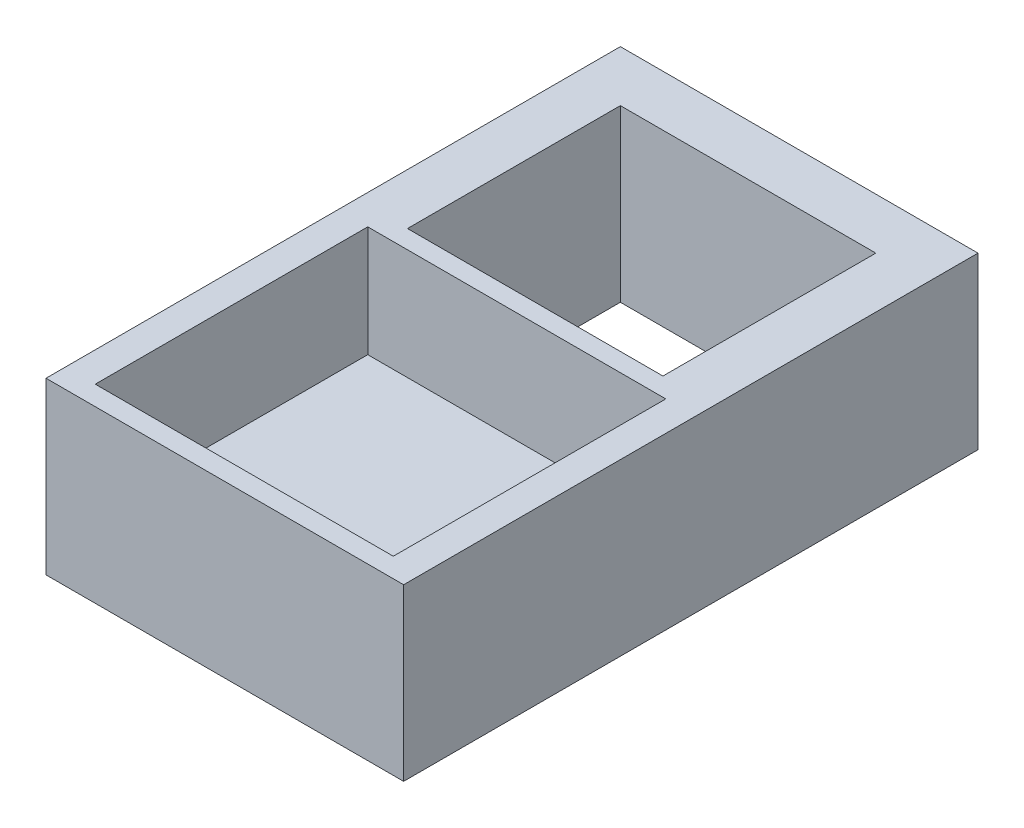
ISO-10303-21;
HEADER;
FILE_DESCRIPTION(('STEP AP214'),'2;1');
FILE_NAME('part.step','',(''),(''),'','','');
FILE_SCHEMA(('AUTOMOTIVE_DESIGN { 1 0 10303 214 1 1 1 1 }'));
ENDSEC;
DATA;
#1=APPLICATION_CONTEXT('core data for automotive mechanical design processes');
#2=APPLICATION_PROTOCOL_DEFINITION('international standard','automotive_design',2000,#1);
#3=PRODUCT_CONTEXT('',#1,'mechanical');
#4=PRODUCT('Part','Part','',(#3));
#5=PRODUCT_RELATED_PRODUCT_CATEGORY('part','',(#4));
#6=PRODUCT_DEFINITION_FORMATION('','',#4);
#7=PRODUCT_DEFINITION_CONTEXT('part definition',#1,'design');
#8=PRODUCT_DEFINITION('design','',#6,#7);
#9=PRODUCT_DEFINITION_SHAPE('','',#8);
#10=(LENGTH_UNIT() NAMED_UNIT(*) SI_UNIT(.MILLI.,.METRE.));
#11=(NAMED_UNIT(*) PLANE_ANGLE_UNIT() SI_UNIT($,.RADIAN.));
#12=(NAMED_UNIT(*) SI_UNIT($,.STERADIAN.) SOLID_ANGLE_UNIT());
#13=UNCERTAINTY_MEASURE_WITH_UNIT(LENGTH_MEASURE(1.E-05),#10,'distance_accuracy_value','');
#14=(GEOMETRIC_REPRESENTATION_CONTEXT(3) GLOBAL_UNCERTAINTY_ASSIGNED_CONTEXT((#13)) GLOBAL_UNIT_ASSIGNED_CONTEXT((#10,
#11,#12)) REPRESENTATION_CONTEXT('',''));
#15=CARTESIAN_POINT('',(0.,0.,0.));
#16=DIRECTION('',(0.,0.,1.));
#17=DIRECTION('',(1.,0.,0.));
#18=AXIS2_PLACEMENT_3D('',#15,#16,#17);
#19=CARTESIAN_POINT('',(0.,20.,0.));
#20=DIRECTION('',(0.,-1.,0.));
#21=DIRECTION('',(0.,0.,-1.));
#22=AXIS2_PLACEMENT_3D('',#19,#20,#21);
#23=PLANE('',#22);
#24=DIRECTION('',(1.,0.,0.));
#25=VECTOR('',#24,1.);
#26=CARTESIAN_POINT('',(-35.921350721156,20.,104.672765982536));
#27=LINE('',#26,#25);
#28=CARTESIAN_POINT('',(-35.921350721156,20.,104.672765982536));
#29=VERTEX_POINT('',#28);
#30=CARTESIAN_POINT('',(-0.921350721155893,20.,104.672765982536));
#31=VERTEX_POINT('',#30);
#32=EDGE_CURVE('E161',#29,#31,#27,.T.);
#33=ORIENTED_EDGE('',*,*,#32,.F.);
#34=DIRECTION('',(0.,0.,1.));
#35=VECTOR('',#34,1.);
#36=CARTESIAN_POINT('',(-35.921350721156,20.,72.6727659825365));
#37=LINE('',#36,#35);
#38=CARTESIAN_POINT('',(-35.921350721156,20.,72.6727659825365));
#39=VERTEX_POINT('',#38);
#40=EDGE_CURVE('E58',#39,#29,#37,.T.);
#41=ORIENTED_EDGE('',*,*,#40,.F.);
#42=DIRECTION('',(-1.,0.,0.));
#43=VECTOR('',#42,1.);
#44=CARTESIAN_POINT('',(-35.921350721156,20.,72.6727659825365));
#45=LINE('',#44,#43);
#46=CARTESIAN_POINT('',(-0.9213507211559,20.,72.6727659825365));
#47=VERTEX_POINT('',#46);
#48=EDGE_CURVE('E152',#47,#39,#45,.T.);
#49=ORIENTED_EDGE('',*,*,#48,.F.);
#50=DIRECTION('',(0.,0.,-1.));
#51=VECTOR('',#50,1.);
#52=CARTESIAN_POINT('',(-0.9213507211559,20.,72.6727659825365));
#53=LINE('',#52,#51);
#54=EDGE_CURVE('E155',#31,#47,#53,.T.);
#55=ORIENTED_EDGE('',*,*,#54,.F.);
#56=EDGE_LOOP('',(#33,#41,#49,#55));
#57=FACE_BOUND('',#56,.T.);
#58=DIRECTION('',(0.,0.,1.));
#59=VECTOR('',#58,1.);
#60=CARTESIAN_POINT('',(-33.4177050089391,20.,70.5119231839167));
#61=LINE('',#60,#59);
#62=CARTESIAN_POINT('',(-33.4177050089391,20.,45.5119231839167));
#63=VERTEX_POINT('',#62);
#64=CARTESIAN_POINT('',(-33.4177050089391,20.,70.5119231839167));
#65=VERTEX_POINT('',#64);
#66=EDGE_CURVE('E173',#63,#65,#61,.T.);
#67=ORIENTED_EDGE('',*,*,#66,.F.);
#68=DIRECTION('',(-1.,0.,0.));
#69=VECTOR('',#68,1.);
#70=CARTESIAN_POINT('',(-33.4177050089391,20.,45.5119231839167));
#71=LINE('',#70,#69);
#72=CARTESIAN_POINT('',(-3.41770500893908,20.,45.5119231839167));
#73=VERTEX_POINT('',#72);
#74=EDGE_CURVE('E171',#73,#63,#71,.T.);
#75=ORIENTED_EDGE('',*,*,#74,.F.);
#76=DIRECTION('',(0.,0.,-1.));
#77=VECTOR('',#76,1.);
#78=CARTESIAN_POINT('',(-3.41770500893908,20.,70.5119231839167));
#79=LINE('',#78,#77);
#80=CARTESIAN_POINT('',(-3.41770500893908,20.,70.5119231839167));
#81=VERTEX_POINT('',#80);
#82=EDGE_CURVE('E178',#81,#73,#79,.T.);
#83=ORIENTED_EDGE('',*,*,#82,.F.);
#84=DIRECTION('',(1.,0.,0.));
#85=VECTOR('',#84,1.);
#86=CARTESIAN_POINT('',(-33.4177050089391,20.,70.5119231839167));
#87=LINE('',#86,#85);
#88=EDGE_CURVE('E176',#65,#81,#87,.T.);
#89=ORIENTED_EDGE('',*,*,#88,.F.);
#90=EDGE_LOOP('',(#67,#75,#83,#89));
#91=FACE_BOUND('',#90,.T.);
#92=DIRECTION('',(0.,0.,1.));
#93=VECTOR('',#92,1.);
#94=CARTESIAN_POINT('',(-39.4177050089391,20.,106.961923183917));
#95=LINE('',#94,#93);
#96=CARTESIAN_POINT('',(-39.4177050089391,20.,39.5119231839167));
#97=VERTEX_POINT('',#96);
#98=CARTESIAN_POINT('',(-39.4177050089391,20.,106.961923183917));
#99=VERTEX_POINT('',#98);
#100=EDGE_CURVE('E198',#97,#99,#95,.T.);
#101=ORIENTED_EDGE('',*,*,#100,.T.);
#102=DIRECTION('',(1.,0.,0.));
#103=VECTOR('',#102,1.);
#104=CARTESIAN_POINT('',(-18.4177050089391,20.,106.961923183917));
#105=LINE('',#104,#103);
#106=CARTESIAN_POINT('',(2.58229499106092,20.,106.961923183917));
#107=VERTEX_POINT('',#106);
#108=EDGE_CURVE('E201',#99,#107,#105,.T.);
#109=ORIENTED_EDGE('',*,*,#108,.T.);
#110=DIRECTION('',(0.,0.,-1.));
#111=VECTOR('',#110,1.);
#112=CARTESIAN_POINT('',(2.58229499106092,20.,106.961923183917));
#113=LINE('',#112,#111);
#114=CARTESIAN_POINT('',(2.58229499106092,20.,39.5119231839167));
#115=VERTEX_POINT('',#114);
#116=EDGE_CURVE('E204',#107,#115,#113,.T.);
#117=ORIENTED_EDGE('',*,*,#116,.T.);
#118=DIRECTION('',(-1.,0.,0.));
#119=VECTOR('',#118,1.);
#120=CARTESIAN_POINT('',(2.58229499106092,20.,39.5119231839167));
#121=LINE('',#120,#119);
#122=EDGE_CURVE('E206',#115,#97,#121,.T.);
#123=ORIENTED_EDGE('',*,*,#122,.T.);
#124=EDGE_LOOP('',(#101,#109,#117,#123));
#125=FACE_BOUND('',#124,.T.);
#126=ADVANCED_FACE('F43',(#57,#91,#125),#23,.F.);
#127=CARTESIAN_POINT('',(0.,0.,0.));
#128=DIRECTION('',(0.,-1.,0.));
#129=DIRECTION('',(0.,0.,-1.));
#130=AXIS2_PLACEMENT_3D('',#127,#128,#129);
#131=PLANE('',#130);
#132=DIRECTION('',(1.,0.,0.));
#133=VECTOR('',#132,1.);
#134=CARTESIAN_POINT('',(-18.4177050089391,0.,106.961923183917));
#135=LINE('',#134,#133);
#136=CARTESIAN_POINT('',(-39.4177050089391,0.,106.961923183917));
#137=VERTEX_POINT('',#136);
#138=CARTESIAN_POINT('',(2.58229499106092,0.,106.961923183917));
#139=VERTEX_POINT('',#138);
#140=EDGE_CURVE('E197',#137,#139,#135,.T.);
#141=ORIENTED_EDGE('',*,*,#140,.F.);
#142=DIRECTION('',(0.,0.,1.));
#143=VECTOR('',#142,1.);
#144=CARTESIAN_POINT('',(-39.4177050089391,0.,78.5119231839167));
#145=LINE('',#144,#143);
#146=CARTESIAN_POINT('',(-39.4177050089391,0.,39.5119231839167));
#147=VERTEX_POINT('',#146);
#148=EDGE_CURVE('E202',#147,#137,#145,.T.);
#149=ORIENTED_EDGE('',*,*,#148,.F.);
#150=DIRECTION('',(-1.,0.,0.));
#151=VECTOR('',#150,1.);
#152=CARTESIAN_POINT('',(-39.4177050089391,0.,39.5119231839167));
#153=LINE('',#152,#151);
#154=CARTESIAN_POINT('',(2.58229499106092,0.,39.5119231839167));
#155=VERTEX_POINT('',#154);
#156=EDGE_CURVE('E214',#155,#147,#153,.T.);
#157=ORIENTED_EDGE('',*,*,#156,.F.);
#158=DIRECTION('',(0.,0.,-1.));
#159=VECTOR('',#158,1.);
#160=CARTESIAN_POINT('',(2.58229499106092,0.,78.5119231839167));
#161=LINE('',#160,#159);
#162=EDGE_CURVE('E211',#139,#155,#161,.T.);
#163=ORIENTED_EDGE('',*,*,#162,.F.);
#164=EDGE_LOOP('',(#141,#149,#157,#163));
#165=FACE_BOUND('',#164,.T.);
#166=DIRECTION('',(-1.,0.,0.));
#167=VECTOR('',#166,1.);
#168=CARTESIAN_POINT('',(-3.41770500893908,0.,45.5119231839167));
#169=LINE('',#168,#167);
#170=CARTESIAN_POINT('',(-3.41770500893908,0.,45.5119231839167));
#171=VERTEX_POINT('',#170);
#172=CARTESIAN_POINT('',(-33.4177050089391,0.,45.5119231839167));
#173=VERTEX_POINT('',#172);
#174=EDGE_CURVE('E174',#171,#173,#169,.T.);
#175=ORIENTED_EDGE('',*,*,#174,.T.);
#176=DIRECTION('',(0.,0.,1.));
#177=VECTOR('',#176,1.);
#178=CARTESIAN_POINT('',(-33.4177050089391,0.,70.5119231839167));
#179=LINE('',#178,#177);
#180=CARTESIAN_POINT('',(-33.4177050089391,0.,70.5119231839167));
#181=VERTEX_POINT('',#180);
#182=EDGE_CURVE('E167',#173,#181,#179,.T.);
#183=ORIENTED_EDGE('',*,*,#182,.T.);
#184=DIRECTION('',(1.,0.,0.));
#185=VECTOR('',#184,1.);
#186=CARTESIAN_POINT('',(-33.4177050089391,0.,70.5119231839167));
#187=LINE('',#186,#185);
#188=CARTESIAN_POINT('',(-3.41770500893908,0.,70.5119231839167));
#189=VERTEX_POINT('',#188);
#190=EDGE_CURVE('E182',#181,#189,#187,.T.);
#191=ORIENTED_EDGE('',*,*,#190,.T.);
#192=DIRECTION('',(0.,0.,-1.));
#193=VECTOR('',#192,1.);
#194=CARTESIAN_POINT('',(-3.41770500893908,0.,70.5119231839167));
#195=LINE('',#194,#193);
#196=EDGE_CURVE('E185',#189,#171,#195,.T.);
#197=ORIENTED_EDGE('',*,*,#196,.T.);
#198=EDGE_LOOP('',(#175,#183,#191,#197));
#199=FACE_BOUND('',#198,.T.);
#200=ADVANCED_FACE('F232',(#165,#199),#131,.T.);
#201=CARTESIAN_POINT('',(-18.4177050089391,20.,106.961923183917));
#202=DIRECTION('',(0.,0.,-1.));
#203=DIRECTION('',(-1.,0.,0.));
#204=AXIS2_PLACEMENT_3D('',#201,#202,#203);
#205=PLANE('',#204);
#206=ORIENTED_EDGE('',*,*,#140,.T.);
#207=DIRECTION('',(0.,-1.,0.));
#208=VECTOR('',#207,1.);
#209=CARTESIAN_POINT('',(2.58229499106092,20.,106.961923183917));
#210=LINE('',#209,#208);
#211=EDGE_CURVE('E51',#107,#139,#210,.T.);
#212=ORIENTED_EDGE('',*,*,#211,.F.);
#213=ORIENTED_EDGE('',*,*,#108,.F.);
#214=DIRECTION('',(0.,-1.,0.));
#215=VECTOR('',#214,1.);
#216=CARTESIAN_POINT('',(-39.4177050089391,20.,106.961923183917));
#217=LINE('',#216,#215);
#218=EDGE_CURVE('E11',#99,#137,#217,.T.);
#219=ORIENTED_EDGE('',*,*,#218,.T.);
#220=EDGE_LOOP('',(#206,#212,#213,#219));
#221=FACE_BOUND('',#220,.T.);
#222=ADVANCED_FACE('F45',(#221),#205,.F.);
#223=CARTESIAN_POINT('',(2.58229499106092,20.,78.5119231839167));
#224=DIRECTION('',(-1.,0.,0.));
#225=DIRECTION('',(0.,0.,1.));
#226=AXIS2_PLACEMENT_3D('',#223,#224,#225);
#227=PLANE('',#226);
#228=ORIENTED_EDGE('',*,*,#162,.T.);
#229=DIRECTION('',(0.,-1.,0.));
#230=VECTOR('',#229,1.);
#231=CARTESIAN_POINT('',(2.58229499106092,20.,39.5119231839167));
#232=LINE('',#231,#230);
#233=EDGE_CURVE('E220',#115,#155,#232,.T.);
#234=ORIENTED_EDGE('',*,*,#233,.F.);
#235=ORIENTED_EDGE('',*,*,#116,.F.);
#236=ORIENTED_EDGE('',*,*,#211,.T.);
#237=EDGE_LOOP('',(#228,#234,#235,#236));
#238=FACE_BOUND('',#237,.T.);
#239=ADVANCED_FACE('F226',(#238),#227,.F.);
#240=CARTESIAN_POINT('',(-39.4177050089391,20.,39.5119231839167));
#241=DIRECTION('',(0.,0.,1.));
#242=DIRECTION('',(1.,0.,0.));
#243=AXIS2_PLACEMENT_3D('',#240,#241,#242);
#244=PLANE('',#243);
#245=ORIENTED_EDGE('',*,*,#156,.T.);
#246=DIRECTION('',(0.,-1.,0.));
#247=VECTOR('',#246,1.);
#248=CARTESIAN_POINT('',(-39.4177050089391,20.,39.5119231839167));
#249=LINE('',#248,#247);
#250=EDGE_CURVE('E208',#97,#147,#249,.T.);
#251=ORIENTED_EDGE('',*,*,#250,.F.);
#252=ORIENTED_EDGE('',*,*,#122,.F.);
#253=ORIENTED_EDGE('',*,*,#233,.T.);
#254=EDGE_LOOP('',(#245,#251,#252,#253));
#255=FACE_BOUND('',#254,.T.);
#256=ADVANCED_FACE('F240',(#255),#244,.F.);
#257=CARTESIAN_POINT('',(-39.4177050089391,20.,78.5119231839167));
#258=DIRECTION('',(1.,0.,0.));
#259=DIRECTION('',(0.,0.,-1.));
#260=AXIS2_PLACEMENT_3D('',#257,#258,#259);
#261=PLANE('',#260);
#262=ORIENTED_EDGE('',*,*,#148,.T.);
#263=ORIENTED_EDGE('',*,*,#218,.F.);
#264=ORIENTED_EDGE('',*,*,#100,.F.);
#265=ORIENTED_EDGE('',*,*,#250,.T.);
#266=EDGE_LOOP('',(#262,#263,#264,#265));
#267=FACE_BOUND('',#266,.T.);
#268=ADVANCED_FACE('F235',(#267),#261,.F.);
#269=CARTESIAN_POINT('',(-33.4177050089391,20.,70.5119231839167));
#270=DIRECTION('',(1.,0.,0.));
#271=DIRECTION('',(0.,0.,-1.));
#272=AXIS2_PLACEMENT_3D('',#269,#270,#271);
#273=PLANE('',#272);
#274=ORIENTED_EDGE('',*,*,#182,.F.);
#275=DIRECTION('',(0.,-1.,0.));
#276=VECTOR('',#275,1.);
#277=CARTESIAN_POINT('',(-33.4177050089391,20.,45.5119231839167));
#278=LINE('',#277,#276);
#279=EDGE_CURVE('E195',#63,#173,#278,.T.);
#280=ORIENTED_EDGE('',*,*,#279,.F.);
#281=ORIENTED_EDGE('',*,*,#66,.T.);
#282=DIRECTION('',(0.,-1.,0.));
#283=VECTOR('',#282,1.);
#284=CARTESIAN_POINT('',(-33.4177050089391,20.,70.5119231839167));
#285=LINE('',#284,#283);
#286=EDGE_CURVE('E193',#65,#181,#285,.T.);
#287=ORIENTED_EDGE('',*,*,#286,.T.);
#288=EDGE_LOOP('',(#274,#280,#281,#287));
#289=FACE_BOUND('',#288,.T.);
#290=ADVANCED_FACE('F252',(#289),#273,.T.);
#291=CARTESIAN_POINT('',(-33.4177050089391,20.,70.5119231839167));
#292=DIRECTION('',(0.,0.,-1.));
#293=DIRECTION('',(-1.,0.,0.));
#294=AXIS2_PLACEMENT_3D('',#291,#292,#293);
#295=PLANE('',#294);
#296=ORIENTED_EDGE('',*,*,#190,.F.);
#297=ORIENTED_EDGE('',*,*,#286,.F.);
#298=ORIENTED_EDGE('',*,*,#88,.T.);
#299=DIRECTION('',(0.,-1.,0.));
#300=VECTOR('',#299,1.);
#301=CARTESIAN_POINT('',(-3.41770500893908,20.,70.5119231839167));
#302=LINE('',#301,#300);
#303=EDGE_CURVE('E191',#81,#189,#302,.T.);
#304=ORIENTED_EDGE('',*,*,#303,.T.);
#305=EDGE_LOOP('',(#296,#297,#298,#304));
#306=FACE_BOUND('',#305,.T.);
#307=ADVANCED_FACE('F293',(#306),#295,.T.);
#308=CARTESIAN_POINT('',(-3.41770500893908,20.,70.5119231839167));
#309=DIRECTION('',(-1.,0.,0.));
#310=DIRECTION('',(0.,0.,1.));
#311=AXIS2_PLACEMENT_3D('',#308,#309,#310);
#312=PLANE('',#311);
#313=ORIENTED_EDGE('',*,*,#196,.F.);
#314=ORIENTED_EDGE('',*,*,#303,.F.);
#315=ORIENTED_EDGE('',*,*,#82,.T.);
#316=DIRECTION('',(0.,-1.,0.));
#317=VECTOR('',#316,1.);
#318=CARTESIAN_POINT('',(-3.41770500893908,20.,45.5119231839167));
#319=LINE('',#318,#317);
#320=EDGE_CURVE('E66',#73,#171,#319,.T.);
#321=ORIENTED_EDGE('',*,*,#320,.T.);
#322=EDGE_LOOP('',(#313,#314,#315,#321));
#323=FACE_BOUND('',#322,.T.);
#324=ADVANCED_FACE('F303',(#323),#312,.T.);
#325=CARTESIAN_POINT('',(-3.41770500893908,20.,45.5119231839167));
#326=DIRECTION('',(0.,0.,1.));
#327=DIRECTION('',(1.,0.,0.));
#328=AXIS2_PLACEMENT_3D('',#325,#326,#327);
#329=PLANE('',#328);
#330=ORIENTED_EDGE('',*,*,#174,.F.);
#331=ORIENTED_EDGE('',*,*,#320,.F.);
#332=ORIENTED_EDGE('',*,*,#74,.T.);
#333=ORIENTED_EDGE('',*,*,#279,.T.);
#334=EDGE_LOOP('',(#330,#331,#332,#333));
#335=FACE_BOUND('',#334,.T.);
#336=ADVANCED_FACE('F313',(#335),#329,.T.);
#337=CARTESIAN_POINT('',(-35.921350721156,7.,72.6727659825365));
#338=DIRECTION('',(-1.,0.,0.));
#339=DIRECTION('',(0.,0.,1.));
#340=AXIS2_PLACEMENT_3D('',#337,#338,#339);
#341=PLANE('',#340);
#342=ORIENTED_EDGE('',*,*,#40,.T.);
#343=DIRECTION('',(0.,1.,0.));
#344=VECTOR('',#343,1.);
#345=CARTESIAN_POINT('',(-35.921350721156,7.,104.672765982536));
#346=LINE('',#345,#344);
#347=CARTESIAN_POINT('',(-35.921350721156,7.,104.672765982536));
#348=VERTEX_POINT('',#347);
#349=EDGE_CURVE('E130',#348,#29,#346,.T.);
#350=ORIENTED_EDGE('',*,*,#349,.F.);
#351=DIRECTION('',(0.,0.,1.));
#352=VECTOR('',#351,1.);
#353=CARTESIAN_POINT('',(-35.921350721156,7.,72.6727659825365));
#354=LINE('',#353,#352);
#355=CARTESIAN_POINT('',(-35.921350721156,7.,72.6727659825365));
#356=VERTEX_POINT('',#355);
#357=EDGE_CURVE('E134',#356,#348,#354,.T.);
#358=ORIENTED_EDGE('',*,*,#357,.F.);
#359=DIRECTION('',(0.,1.,0.));
#360=VECTOR('',#359,1.);
#361=CARTESIAN_POINT('',(-35.921350721156,7.,72.6727659825365));
#362=LINE('',#361,#360);
#363=EDGE_CURVE('E165',#356,#39,#362,.T.);
#364=ORIENTED_EDGE('',*,*,#363,.T.);
#365=EDGE_LOOP('',(#342,#350,#358,#364));
#366=FACE_BOUND('',#365,.T.);
#367=ADVANCED_FACE('F132',(#366),#341,.F.);
#368=CARTESIAN_POINT('',(-35.921350721156,7.,72.6727659825365));
#369=DIRECTION('',(0.,0.,-1.));
#370=DIRECTION('',(-1.,0.,0.));
#371=AXIS2_PLACEMENT_3D('',#368,#369,#370);
#372=PLANE('',#371);
#373=ORIENTED_EDGE('',*,*,#48,.T.);
#374=ORIENTED_EDGE('',*,*,#363,.F.);
#375=DIRECTION('',(-1.,0.,0.));
#376=VECTOR('',#375,1.);
#377=CARTESIAN_POINT('',(-35.921350721156,7.,72.6727659825365));
#378=LINE('',#377,#376);
#379=CARTESIAN_POINT('',(-0.9213507211559,7.,72.6727659825365));
#380=VERTEX_POINT('',#379);
#381=EDGE_CURVE('E140',#380,#356,#378,.T.);
#382=ORIENTED_EDGE('',*,*,#381,.F.);
#383=DIRECTION('',(0.,1.,0.));
#384=VECTOR('',#383,1.);
#385=CARTESIAN_POINT('',(-0.9213507211559,7.,72.6727659825365));
#386=LINE('',#385,#384);
#387=EDGE_CURVE('E168',#380,#47,#386,.T.);
#388=ORIENTED_EDGE('',*,*,#387,.T.);
#389=EDGE_LOOP('',(#373,#374,#382,#388));
#390=FACE_BOUND('',#389,.T.);
#391=ADVANCED_FACE('F344',(#390),#372,.F.);
#392=CARTESIAN_POINT('',(-0.9213507211559,7.,72.6727659825365));
#393=DIRECTION('',(1.,0.,0.));
#394=DIRECTION('',(0.,0.,-1.));
#395=AXIS2_PLACEMENT_3D('',#392,#393,#394);
#396=PLANE('',#395);
#397=ORIENTED_EDGE('',*,*,#54,.T.);
#398=ORIENTED_EDGE('',*,*,#387,.F.);
#399=DIRECTION('',(0.,0.,-1.));
#400=VECTOR('',#399,1.);
#401=CARTESIAN_POINT('',(-0.9213507211559,7.,72.6727659825365));
#402=LINE('',#401,#400);
#403=CARTESIAN_POINT('',(-0.921350721155893,7.,104.672765982536));
#404=VERTEX_POINT('',#403);
#405=EDGE_CURVE('E148',#404,#380,#402,.T.);
#406=ORIENTED_EDGE('',*,*,#405,.F.);
#407=DIRECTION('',(0.,1.,0.));
#408=VECTOR('',#407,1.);
#409=CARTESIAN_POINT('',(-0.921350721155893,7.,104.672765982536));
#410=LINE('',#409,#408);
#411=EDGE_CURVE('E139',#404,#31,#410,.T.);
#412=ORIENTED_EDGE('',*,*,#411,.T.);
#413=EDGE_LOOP('',(#397,#398,#406,#412));
#414=FACE_BOUND('',#413,.T.);
#415=ADVANCED_FACE('F354',(#414),#396,.F.);
#416=CARTESIAN_POINT('',(-35.921350721156,7.,104.672765982536));
#417=DIRECTION('',(0.,0.,1.));
#418=DIRECTION('',(1.,0.,0.));
#419=AXIS2_PLACEMENT_3D('',#416,#417,#418);
#420=PLANE('',#419);
#421=ORIENTED_EDGE('',*,*,#32,.T.);
#422=ORIENTED_EDGE('',*,*,#411,.F.);
#423=DIRECTION('',(1.,0.,0.));
#424=VECTOR('',#423,1.);
#425=CARTESIAN_POINT('',(-35.921350721156,7.,104.672765982536));
#426=LINE('',#425,#424);
#427=EDGE_CURVE('E143',#348,#404,#426,.T.);
#428=ORIENTED_EDGE('',*,*,#427,.F.);
#429=ORIENTED_EDGE('',*,*,#349,.T.);
#430=EDGE_LOOP('',(#421,#422,#428,#429));
#431=FACE_BOUND('',#430,.T.);
#432=ADVANCED_FACE('F144',(#431),#420,.F.);
#433=CARTESIAN_POINT('',(0.,7.,0.));
#434=DIRECTION('',(0.,1.,0.));
#435=DIRECTION('',(0.,0.,1.));
#436=AXIS2_PLACEMENT_3D('',#433,#434,#435);
#437=PLANE('',#436);
#438=ORIENTED_EDGE('',*,*,#357,.T.);
#439=ORIENTED_EDGE('',*,*,#427,.T.);
#440=ORIENTED_EDGE('',*,*,#405,.T.);
#441=ORIENTED_EDGE('',*,*,#381,.T.);
#442=EDGE_LOOP('',(#438,#439,#440,#441));
#443=FACE_BOUND('',#442,.T.);
#444=ADVANCED_FACE('F150',(#443),#437,.T.);
#445=CLOSED_SHELL('',(#126,#200,#222,#239,#256,#268,#290,#307,#324,#336,#367,#391,#415,#432,#444));
#446=MANIFOLD_SOLID_BREP('B2',#445);
#447=ADVANCED_BREP_SHAPE_REPRESENTATION('',(#18,#446),#14);
#448=SHAPE_DEFINITION_REPRESENTATION(#9,#447);
ENDSEC;
END-ISO-10303-21;
